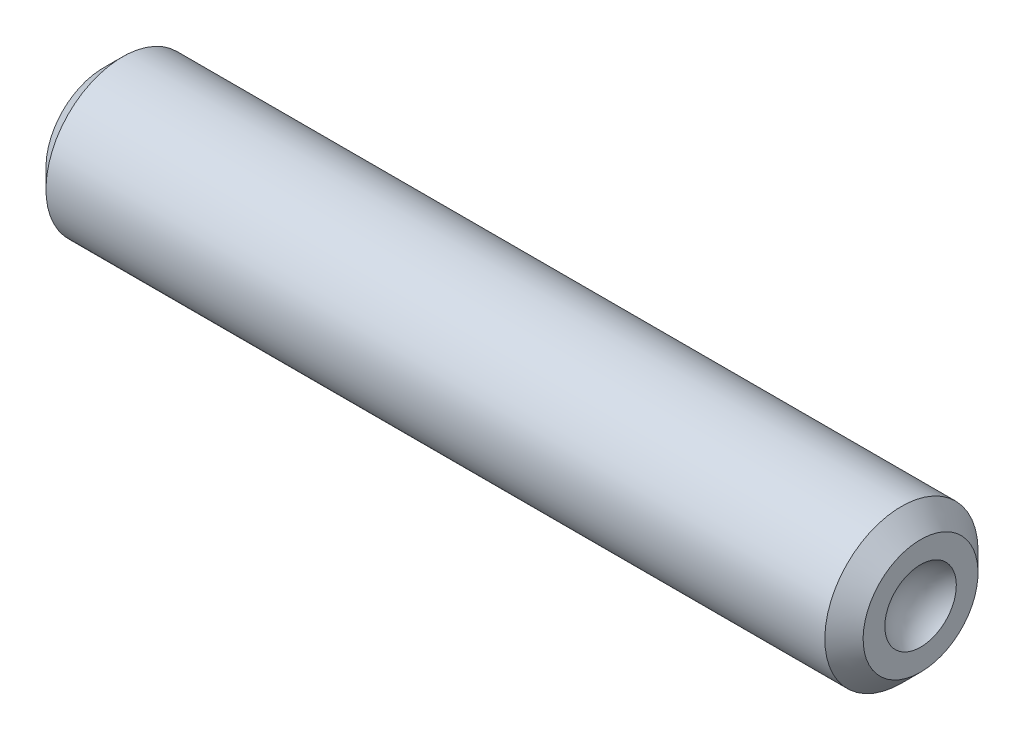
ISO-10303-21;
HEADER;
FILE_DESCRIPTION(('STEP AP214'),'2;1');
FILE_NAME('part.step','',(''),(''),'','','');
FILE_SCHEMA(('AUTOMOTIVE_DESIGN { 1 0 10303 214 1 1 1 1 }'));
ENDSEC;
DATA;
#1=APPLICATION_CONTEXT('core data for automotive mechanical design processes');
#2=APPLICATION_PROTOCOL_DEFINITION('international standard','automotive_design',2000,#1);
#3=PRODUCT_CONTEXT('',#1,'mechanical');
#4=PRODUCT('Part','Part','',(#3));
#5=PRODUCT_RELATED_PRODUCT_CATEGORY('part','',(#4));
#6=PRODUCT_DEFINITION_FORMATION('','',#4);
#7=PRODUCT_DEFINITION_CONTEXT('part definition',#1,'design');
#8=PRODUCT_DEFINITION('design','',#6,#7);
#9=PRODUCT_DEFINITION_SHAPE('','',#8);
#10=(LENGTH_UNIT() NAMED_UNIT(*) SI_UNIT(.MILLI.,.METRE.));
#11=(NAMED_UNIT(*) PLANE_ANGLE_UNIT() SI_UNIT($,.RADIAN.));
#12=(NAMED_UNIT(*) SI_UNIT($,.STERADIAN.) SOLID_ANGLE_UNIT());
#13=UNCERTAINTY_MEASURE_WITH_UNIT(LENGTH_MEASURE(1.E-05),#10,'distance_accuracy_value','');
#14=(GEOMETRIC_REPRESENTATION_CONTEXT(3) GLOBAL_UNCERTAINTY_ASSIGNED_CONTEXT((#13)) GLOBAL_UNIT_ASSIGNED_CONTEXT((#10,
#11,#12)) REPRESENTATION_CONTEXT('',''));
#15=CARTESIAN_POINT('',(0.,0.,0.));
#16=DIRECTION('',(0.,0.,1.));
#17=DIRECTION('',(1.,0.,0.));
#18=AXIS2_PLACEMENT_3D('',#15,#16,#17);
#19=CARTESIAN_POINT('',(0.,0.,0.));
#20=DIRECTION('',(1.,0.,0.));
#21=DIRECTION('',(0.,1.,0.));
#22=AXIS2_PLACEMENT_3D('',#19,#20,#21);
#23=PLANE('',#22);
#24=DIRECTION('',(0.,-0.5,-0.866025403784439));
#25=VECTOR('',#24,1.);
#26=CARTESIAN_POINT('',(0.,0.866025403784439,0.));
#27=LINE('',#26,#25);
#28=CARTESIAN_POINT('',(0.,0.866025403784439,0.));
#29=VERTEX_POINT('',#28);
#30=CARTESIAN_POINT('',(0.,0.43301270189222,-0.75));
#31=VERTEX_POINT('',#30);
#32=EDGE_CURVE('E107',#29,#31,#27,.T.);
#33=ORIENTED_EDGE('',*,*,#32,.F.);
#34=DIRECTION('',(0.,0.5,-0.866025403784439));
#35=VECTOR('',#34,1.);
#36=CARTESIAN_POINT('',(0.,0.433012701892219,0.75));
#37=LINE('',#36,#35);
#38=CARTESIAN_POINT('',(0.,0.433012701892219,0.75));
#39=VERTEX_POINT('',#38);
#40=EDGE_CURVE('E49',#39,#29,#37,.T.);
#41=ORIENTED_EDGE('',*,*,#40,.F.);
#42=DIRECTION('',(0.,1.,0.));
#43=VECTOR('',#42,1.);
#44=CARTESIAN_POINT('',(0.,-0.43301270189222,0.75));
#45=LINE('',#44,#43);
#46=CARTESIAN_POINT('',(0.,-0.43301270189222,0.75));
#47=VERTEX_POINT('',#46);
#48=EDGE_CURVE('E122',#47,#39,#45,.T.);
#49=ORIENTED_EDGE('',*,*,#48,.F.);
#50=DIRECTION('',(0.,0.5,0.866025403784439));
#51=VECTOR('',#50,1.);
#52=CARTESIAN_POINT('',(0.,-0.866025403784439,0.));
#53=LINE('',#52,#51);
#54=CARTESIAN_POINT('',(0.,-0.866025403784439,0.));
#55=VERTEX_POINT('',#54);
#56=EDGE_CURVE('E116',#55,#47,#53,.T.);
#57=ORIENTED_EDGE('',*,*,#56,.F.);
#58=DIRECTION('',(0.,-0.5,0.866025403784439));
#59=VECTOR('',#58,1.);
#60=CARTESIAN_POINT('',(0.,-0.433012701892219,-0.75));
#61=LINE('',#60,#59);
#62=CARTESIAN_POINT('',(0.,-0.433012701892219,-0.75));
#63=VERTEX_POINT('',#62);
#64=EDGE_CURVE('E114',#63,#55,#61,.T.);
#65=ORIENTED_EDGE('',*,*,#64,.F.);
#66=DIRECTION('',(0.,-1.,0.));
#67=VECTOR('',#66,1.);
#68=CARTESIAN_POINT('',(0.,0.43301270189222,-0.75));
#69=LINE('',#68,#67);
#70=EDGE_CURVE('E100',#31,#63,#69,.T.);
#71=ORIENTED_EDGE('',*,*,#70,.F.);
#72=EDGE_LOOP('',(#33,#41,#49,#57,#65,#71));
#73=FACE_BOUND('',#72,.T.);
#74=CARTESIAN_POINT('',(0.,0.,0.));
#75=DIRECTION('',(-1.,0.,0.));
#76=DIRECTION('',(0.,-1.,0.));
#77=AXIS2_PLACEMENT_3D('',#74,#75,#76);
#78=CIRCLE('',#77,1.125);
#79=CARTESIAN_POINT('',(0.,-1.125,0.));
#80=VERTEX_POINT('',#79);
#81=EDGE_CURVE('E12',#80,#80,#78,.T.);
#82=ORIENTED_EDGE('',*,*,#81,.T.);
#83=EDGE_LOOP('',(#82));
#84=FACE_BOUND('',#83,.T.);
#85=ADVANCED_FACE('F35',(#73,#84),#23,.F.);
#86=CARTESIAN_POINT('',(0.375000000000001,0.,0.));
#87=DIRECTION('',(1.,0.,0.));
#88=DIRECTION('',(0.,1.,0.));
#89=AXIS2_PLACEMENT_3D('',#86,#87,#88);
#90=CONICAL_SURFACE('',#89,1.5,0.785398163397447);
#91=ORIENTED_EDGE('',*,*,#81,.F.);
#92=EDGE_LOOP('',(#91));
#93=FACE_BOUND('',#92,.T.);
#94=CARTESIAN_POINT('',(0.375000000000001,0.,0.));
#95=DIRECTION('',(-1.,0.,0.));
#96=DIRECTION('',(0.,-1.,0.));
#97=AXIS2_PLACEMENT_3D('',#94,#95,#96);
#98=CIRCLE('',#97,1.5);
#99=CARTESIAN_POINT('',(0.375000000000001,-1.5,0.));
#100=VERTEX_POINT('',#99);
#101=EDGE_CURVE('E42',#100,#100,#98,.T.);
#102=ORIENTED_EDGE('',*,*,#101,.T.);
#103=EDGE_LOOP('',(#102));
#104=FACE_BOUND('',#103,.T.);
#105=ADVANCED_FACE('F145',(#93,#104),#90,.T.);
#106=CARTESIAN_POINT('',(0.,0.,0.));
#107=DIRECTION('',(-1.,0.,0.));
#108=DIRECTION('',(0.,-1.,0.));
#109=AXIS2_PLACEMENT_3D('',#106,#107,#108);
#110=CYLINDRICAL_SURFACE('',#109,1.5);
#111=ORIENTED_EDGE('',*,*,#101,.F.);
#112=EDGE_LOOP('',(#111));
#113=FACE_BOUND('',#112,.T.);
#114=CARTESIAN_POINT('',(15.625,0.,0.));
#115=DIRECTION('',(-1.,0.,0.));
#116=DIRECTION('',(0.,-1.,0.));
#117=AXIS2_PLACEMENT_3D('',#114,#115,#116);
#118=CIRCLE('',#117,1.5);
#119=CARTESIAN_POINT('',(15.625,-1.5,0.));
#120=VERTEX_POINT('',#119);
#121=EDGE_CURVE('E140',#120,#120,#118,.T.);
#122=ORIENTED_EDGE('',*,*,#121,.T.);
#123=EDGE_LOOP('',(#122));
#124=FACE_BOUND('',#123,.T.);
#125=ADVANCED_FACE('F147',(#113,#124),#110,.T.);
#126=CARTESIAN_POINT('',(16.,0.,0.));
#127=DIRECTION('',(-1.,0.,0.));
#128=DIRECTION('',(0.,-1.,0.));
#129=AXIS2_PLACEMENT_3D('',#126,#127,#128);
#130=CONICAL_SURFACE('',#129,1.125,0.785398163397447);
#131=ORIENTED_EDGE('',*,*,#121,.F.);
#132=EDGE_LOOP('',(#131));
#133=FACE_BOUND('',#132,.T.);
#134=CARTESIAN_POINT('',(16.,0.,0.));
#135=DIRECTION('',(-1.,0.,0.));
#136=DIRECTION('',(0.,-1.,0.));
#137=AXIS2_PLACEMENT_3D('',#134,#135,#136);
#138=CIRCLE('',#137,1.125);
#139=CARTESIAN_POINT('',(16.,-1.125,0.));
#140=VERTEX_POINT('',#139);
#141=EDGE_CURVE('E137',#140,#140,#138,.T.);
#142=ORIENTED_EDGE('',*,*,#141,.T.);
#143=EDGE_LOOP('',(#142));
#144=FACE_BOUND('',#143,.T.);
#145=ADVANCED_FACE('F150',(#133,#144),#130,.T.);
#146=CARTESIAN_POINT('',(16.,1.125,0.));
#147=DIRECTION('',(-1.,0.,0.));
#148=DIRECTION('',(0.,-1.,0.));
#149=AXIS2_PLACEMENT_3D('',#146,#147,#148);
#150=PLANE('',#149);
#151=ORIENTED_EDGE('',*,*,#141,.F.);
#152=EDGE_LOOP('',(#151));
#153=FACE_BOUND('',#152,.T.);
#154=CARTESIAN_POINT('',(16.,0.,0.));
#155=DIRECTION('',(-1.,0.,0.));
#156=DIRECTION('',(0.,-1.,0.));
#157=AXIS2_PLACEMENT_3D('',#154,#155,#156);
#158=CIRCLE('',#157,0.7);
#159=CARTESIAN_POINT('',(16.,-0.7,0.));
#160=VERTEX_POINT('',#159);
#161=EDGE_CURVE('E134',#160,#160,#158,.T.);
#162=ORIENTED_EDGE('',*,*,#161,.T.);
#163=EDGE_LOOP('',(#162));
#164=FACE_BOUND('',#163,.T.);
#165=ADVANCED_FACE('F156',(#153,#164),#150,.F.);
#166=CARTESIAN_POINT('',(16.4658333333333,0.,0.));
#167=DIRECTION('',(-1.,0.,0.));
#168=DIRECTION('',(0.,-1.,0.));
#169=AXIS2_PLACEMENT_3D('',#166,#167,#168);
#170=SPHERICAL_SURFACE('',#169,0.840833333333333);
#171=ORIENTED_EDGE('',*,*,#161,.F.);
#172=EDGE_LOOP('',(#171));
#173=FACE_BOUND('',#172,.T.);
#174=ADVANCED_FACE('F162',(#173),#170,.F.);
#175=CARTESIAN_POINT('',(18.2912878474779,0.433012701892219,0.75));
#176=DIRECTION('',(0.,0.866025403784438,0.5));
#177=DIRECTION('',(0.,-0.5,0.866025403784439));
#178=AXIS2_PLACEMENT_3D('',#175,#176,#177);
#179=PLANE('',#178);
#180=DIRECTION('',(0.,-0.5,0.866025403784439));
#181=VECTOR('',#180,1.);
#182=CARTESIAN_POINT('',(14.,0.433012701892219,0.75));
#183=LINE('',#182,#181);
#184=CARTESIAN_POINT('',(14.,0.866025403784439,0.));
#185=VERTEX_POINT('',#184);
#186=CARTESIAN_POINT('',(14.,0.433012701892219,0.75));
#187=VERTEX_POINT('',#186);
#188=EDGE_CURVE('E68',#185,#187,#183,.T.);
#189=ORIENTED_EDGE('',*,*,#188,.T.);
#190=DIRECTION('',(-1.,0.,0.));
#191=VECTOR('',#190,1.);
#192=CARTESIAN_POINT('',(18.2912878474779,0.433012701892219,0.75));
#193=LINE('',#192,#191);
#194=EDGE_CURVE('E125',#187,#39,#193,.T.);
#195=ORIENTED_EDGE('',*,*,#194,.T.);
#196=ORIENTED_EDGE('',*,*,#40,.T.);
#197=DIRECTION('',(-1.,0.,0.));
#198=VECTOR('',#197,1.);
#199=CARTESIAN_POINT('',(18.2912878474779,0.866025403784439,0.));
#200=LINE('',#199,#198);
#201=EDGE_CURVE('E104',#185,#29,#200,.T.);
#202=ORIENTED_EDGE('',*,*,#201,.F.);
#203=EDGE_LOOP('',(#189,#195,#196,#202));
#204=FACE_BOUND('',#203,.T.);
#205=ADVANCED_FACE('F167',(#204),#179,.F.);
#206=CARTESIAN_POINT('',(18.2912878474779,-0.43301270189222,0.75));
#207=DIRECTION('',(0.,0.,1.));
#208=DIRECTION('',(0.,-1.,0.));
#209=AXIS2_PLACEMENT_3D('',#206,#207,#208);
#210=PLANE('',#209);
#211=DIRECTION('',(0.,-1.,0.));
#212=VECTOR('',#211,1.);
#213=CARTESIAN_POINT('',(14.,-0.43301270189222,0.75));
#214=LINE('',#213,#212);
#215=CARTESIAN_POINT('',(14.,-0.43301270189222,0.75));
#216=VERTEX_POINT('',#215);
#217=EDGE_CURVE('E267',#187,#216,#214,.T.);
#218=ORIENTED_EDGE('',*,*,#217,.T.);
#219=DIRECTION('',(-1.,0.,0.));
#220=VECTOR('',#219,1.);
#221=CARTESIAN_POINT('',(18.2912878474779,-0.43301270189222,0.75));
#222=LINE('',#221,#220);
#223=EDGE_CURVE('E127',#216,#47,#222,.T.);
#224=ORIENTED_EDGE('',*,*,#223,.T.);
#225=ORIENTED_EDGE('',*,*,#48,.T.);
#226=ORIENTED_EDGE('',*,*,#194,.F.);
#227=EDGE_LOOP('',(#218,#224,#225,#226));
#228=FACE_BOUND('',#227,.T.);
#229=ADVANCED_FACE('F172',(#228),#210,.F.);
#230=CARTESIAN_POINT('',(18.2912878474779,-0.866025403784439,0.));
#231=DIRECTION('',(0.,-0.866025403784439,0.5));
#232=DIRECTION('',(0.,-0.5,-0.866025403784439));
#233=AXIS2_PLACEMENT_3D('',#230,#231,#232);
#234=PLANE('',#233);
#235=DIRECTION('',(0.,-0.5,-0.866025403784439));
#236=VECTOR('',#235,1.);
#237=CARTESIAN_POINT('',(14.,-0.866025403784439,0.));
#238=LINE('',#237,#236);
#239=CARTESIAN_POINT('',(14.,-0.866025403784439,0.));
#240=VERTEX_POINT('',#239);
#241=EDGE_CURVE('E270',#216,#240,#238,.T.);
#242=ORIENTED_EDGE('',*,*,#241,.T.);
#243=DIRECTION('',(-1.,0.,0.));
#244=VECTOR('',#243,1.);
#245=CARTESIAN_POINT('',(18.2912878474779,-0.866025403784439,0.));
#246=LINE('',#245,#244);
#247=EDGE_CURVE('E129',#240,#55,#246,.T.);
#248=ORIENTED_EDGE('',*,*,#247,.T.);
#249=ORIENTED_EDGE('',*,*,#56,.T.);
#250=ORIENTED_EDGE('',*,*,#223,.F.);
#251=EDGE_LOOP('',(#242,#248,#249,#250));
#252=FACE_BOUND('',#251,.T.);
#253=ADVANCED_FACE('F217',(#252),#234,.F.);
#254=CARTESIAN_POINT('',(18.2912878474779,-0.43301270189222,-0.75));
#255=DIRECTION('',(0.,-0.866025403784439,-0.5));
#256=DIRECTION('',(0.,0.5,-0.866025403784439));
#257=AXIS2_PLACEMENT_3D('',#254,#255,#256);
#258=PLANE('',#257);
#259=DIRECTION('',(0.,0.5,-0.866025403784439));
#260=VECTOR('',#259,1.);
#261=CARTESIAN_POINT('',(14.,-0.43301270189222,-0.75));
#262=LINE('',#261,#260);
#263=CARTESIAN_POINT('',(14.,-0.43301270189222,-0.75));
#264=VERTEX_POINT('',#263);
#265=EDGE_CURVE('E58',#240,#264,#262,.T.);
#266=ORIENTED_EDGE('',*,*,#265,.T.);
#267=DIRECTION('',(-1.,0.,0.));
#268=VECTOR('',#267,1.);
#269=CARTESIAN_POINT('',(18.2912878474779,-0.43301270189222,-0.75));
#270=LINE('',#269,#268);
#271=EDGE_CURVE('E103',#264,#63,#270,.T.);
#272=ORIENTED_EDGE('',*,*,#271,.T.);
#273=ORIENTED_EDGE('',*,*,#64,.T.);
#274=ORIENTED_EDGE('',*,*,#247,.F.);
#275=EDGE_LOOP('',(#266,#272,#273,#274));
#276=FACE_BOUND('',#275,.T.);
#277=ADVANCED_FACE('F227',(#276),#258,.F.);
#278=CARTESIAN_POINT('',(18.2912878474779,0.433012701892219,-0.75));
#279=DIRECTION('',(0.,0.,-1.));
#280=DIRECTION('',(-1.,0.,0.));
#281=AXIS2_PLACEMENT_3D('',#278,#279,#280);
#282=PLANE('',#281);
#283=DIRECTION('',(0.,1.,0.));
#284=VECTOR('',#283,1.);
#285=CARTESIAN_POINT('',(14.,0.43301270189222,-0.75));
#286=LINE('',#285,#284);
#287=CARTESIAN_POINT('',(14.,0.43301270189222,-0.75));
#288=VERTEX_POINT('',#287);
#289=EDGE_CURVE('E102',#264,#288,#286,.T.);
#290=ORIENTED_EDGE('',*,*,#289,.T.);
#291=DIRECTION('',(-1.,0.,0.));
#292=VECTOR('',#291,1.);
#293=CARTESIAN_POINT('',(18.2912878474779,0.433012701892219,-0.75));
#294=LINE('',#293,#292);
#295=EDGE_CURVE('E95',#288,#31,#294,.T.);
#296=ORIENTED_EDGE('',*,*,#295,.T.);
#297=ORIENTED_EDGE('',*,*,#70,.T.);
#298=ORIENTED_EDGE('',*,*,#271,.F.);
#299=EDGE_LOOP('',(#290,#296,#297,#298));
#300=FACE_BOUND('',#299,.T.);
#301=ADVANCED_FACE('F97',(#300),#282,.F.);
#302=CARTESIAN_POINT('',(18.2912878474779,0.866025403784439,0.));
#303=DIRECTION('',(0.,0.866025403784439,-0.5));
#304=DIRECTION('',(0.,0.5,0.866025403784439));
#305=AXIS2_PLACEMENT_3D('',#302,#303,#304);
#306=PLANE('',#305);
#307=DIRECTION('',(0.,0.5,0.866025403784439));
#308=VECTOR('',#307,1.);
#309=CARTESIAN_POINT('',(14.,0.866025403784439,0.));
#310=LINE('',#309,#308);
#311=EDGE_CURVE('E77',#288,#185,#310,.T.);
#312=ORIENTED_EDGE('',*,*,#311,.T.);
#313=ORIENTED_EDGE('',*,*,#201,.T.);
#314=ORIENTED_EDGE('',*,*,#32,.T.);
#315=ORIENTED_EDGE('',*,*,#295,.F.);
#316=EDGE_LOOP('',(#312,#313,#314,#315));
#317=FACE_BOUND('',#316,.T.);
#318=ADVANCED_FACE('F108',(#317),#306,.F.);
#319=CARTESIAN_POINT('',(14.,1.125,0.));
#320=DIRECTION('',(-1.,0.,0.));
#321=DIRECTION('',(0.,-1.,0.));
#322=AXIS2_PLACEMENT_3D('',#319,#320,#321);
#323=PLANE('',#322);
#324=ORIENTED_EDGE('',*,*,#188,.F.);
#325=ORIENTED_EDGE('',*,*,#311,.F.);
#326=ORIENTED_EDGE('',*,*,#289,.F.);
#327=ORIENTED_EDGE('',*,*,#265,.F.);
#328=ORIENTED_EDGE('',*,*,#241,.F.);
#329=ORIENTED_EDGE('',*,*,#217,.F.);
#330=EDGE_LOOP('',(#324,#325,#326,#327,#328,#329));
#331=FACE_BOUND('',#330,.T.);
#332=ADVANCED_FACE('F253',(#331),#323,.T.);
#333=CLOSED_SHELL('',(#85,#105,#125,#145,#165,#174,#205,#229,#253,#277,#301,#318,#332));
#334=MANIFOLD_SOLID_BREP('B2',#333);
#335=ADVANCED_BREP_SHAPE_REPRESENTATION('',(#18,#334),#14);
#336=SHAPE_DEFINITION_REPRESENTATION(#9,#335);
ENDSEC;
END-ISO-10303-21;
